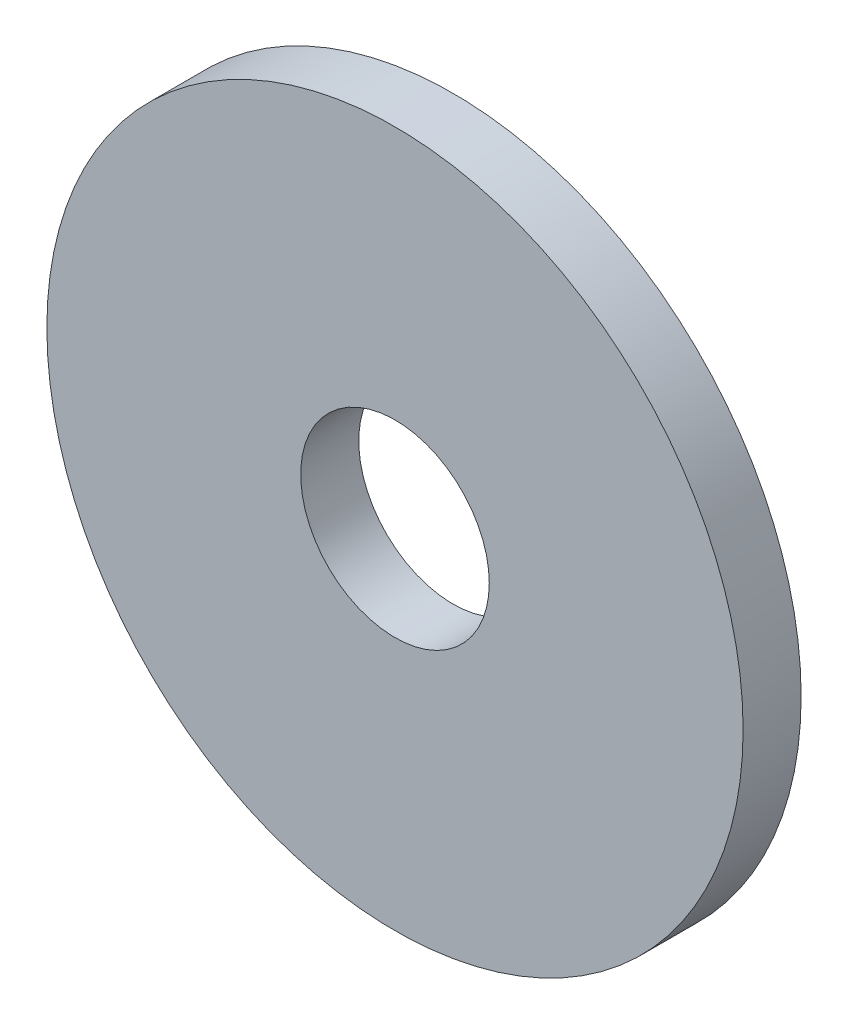
ISO-10303-21;
HEADER;
FILE_DESCRIPTION(('STEP AP214'),'2;1');
FILE_NAME('part.step','',(''),(''),'','','');
FILE_SCHEMA(('AUTOMOTIVE_DESIGN { 1 0 10303 214 1 1 1 1 }'));
ENDSEC;
DATA;
#1=APPLICATION_CONTEXT('core data for automotive mechanical design processes');
#2=APPLICATION_PROTOCOL_DEFINITION('international standard','automotive_design',2000,#1);
#3=PRODUCT_CONTEXT('',#1,'mechanical');
#4=PRODUCT('Part','Part','',(#3));
#5=PRODUCT_RELATED_PRODUCT_CATEGORY('part','',(#4));
#6=PRODUCT_DEFINITION_FORMATION('','',#4);
#7=PRODUCT_DEFINITION_CONTEXT('part definition',#1,'design');
#8=PRODUCT_DEFINITION('design','',#6,#7);
#9=PRODUCT_DEFINITION_SHAPE('','',#8);
#10=(LENGTH_UNIT() NAMED_UNIT(*) SI_UNIT(.MILLI.,.METRE.));
#11=(NAMED_UNIT(*) PLANE_ANGLE_UNIT() SI_UNIT($,.RADIAN.));
#12=(NAMED_UNIT(*) SI_UNIT($,.STERADIAN.) SOLID_ANGLE_UNIT());
#13=UNCERTAINTY_MEASURE_WITH_UNIT(LENGTH_MEASURE(1.E-05),#10,'distance_accuracy_value','');
#14=(GEOMETRIC_REPRESENTATION_CONTEXT(3) GLOBAL_UNCERTAINTY_ASSIGNED_CONTEXT((#13)) GLOBAL_UNIT_ASSIGNED_CONTEXT((#10,
#11,#12)) REPRESENTATION_CONTEXT('',''));
#15=CARTESIAN_POINT('',(0.,0.,0.));
#16=DIRECTION('',(0.,0.,1.));
#17=DIRECTION('',(1.,0.,0.));
#18=AXIS2_PLACEMENT_3D('',#15,#16,#17);
#19=CARTESIAN_POINT('',(0.,0.,1.));
#20=DIRECTION('',(0.,0.,1.));
#21=DIRECTION('',(1.,0.,0.));
#22=AXIS2_PLACEMENT_3D('',#19,#20,#21);
#23=PLANE('',#22);
#24=CARTESIAN_POINT('',(0.,0.,1.));
#25=DIRECTION('',(0.,0.,1.));
#26=DIRECTION('',(1.,0.,0.));
#27=AXIS2_PLACEMENT_3D('',#24,#25,#26);
#28=CIRCLE('',#27,6.);
#29=CARTESIAN_POINT('',(6.,0.,1.));
#30=VERTEX_POINT('',#29);
#31=EDGE_CURVE('E10',#30,#30,#28,.T.);
#32=ORIENTED_EDGE('',*,*,#31,.T.);
#33=EDGE_LOOP('',(#32));
#34=FACE_BOUND('',#33,.T.);
#35=CARTESIAN_POINT('',(0.,0.,1.));
#36=DIRECTION('',(0.,0.,1.));
#37=DIRECTION('',(1.,0.,0.));
#38=AXIS2_PLACEMENT_3D('',#35,#36,#37);
#39=CIRCLE('',#38,1.625);
#40=CARTESIAN_POINT('',(1.625,0.,1.));
#41=VERTEX_POINT('',#40);
#42=EDGE_CURVE('E54',#41,#41,#39,.T.);
#43=ORIENTED_EDGE('',*,*,#42,.F.);
#44=EDGE_LOOP('',(#43));
#45=FACE_BOUND('',#44,.T.);
#46=ADVANCED_FACE('F41',(#34,#45),#23,.T.);
#47=CARTESIAN_POINT('',(0.,0.,0.));
#48=DIRECTION('',(0.,0.,1.));
#49=DIRECTION('',(1.,0.,0.));
#50=AXIS2_PLACEMENT_3D('',#47,#48,#49);
#51=PLANE('',#50);
#52=CARTESIAN_POINT('',(0.,0.,0.));
#53=DIRECTION('',(0.,0.,1.));
#54=DIRECTION('',(1.,0.,0.));
#55=AXIS2_PLACEMENT_3D('',#52,#53,#54);
#56=CIRCLE('',#55,6.);
#57=CARTESIAN_POINT('',(6.,0.,0.));
#58=VERTEX_POINT('',#57);
#59=EDGE_CURVE('E45',#58,#58,#56,.T.);
#60=ORIENTED_EDGE('',*,*,#59,.F.);
#61=EDGE_LOOP('',(#60));
#62=FACE_BOUND('',#61,.T.);
#63=CARTESIAN_POINT('',(0.,0.,0.));
#64=DIRECTION('',(0.,0.,1.));
#65=DIRECTION('',(1.,0.,0.));
#66=AXIS2_PLACEMENT_3D('',#63,#64,#65);
#67=CIRCLE('',#66,1.625);
#68=CARTESIAN_POINT('',(1.625,0.,0.));
#69=VERTEX_POINT('',#68);
#70=EDGE_CURVE('E56',#69,#69,#67,.T.);
#71=ORIENTED_EDGE('',*,*,#70,.T.);
#72=EDGE_LOOP('',(#71));
#73=FACE_BOUND('',#72,.T.);
#74=ADVANCED_FACE('F68',(#62,#73),#51,.F.);
#75=CARTESIAN_POINT('',(0.,0.,1.));
#76=DIRECTION('',(0.,0.,-1.));
#77=DIRECTION('',(-1.,0.,0.));
#78=AXIS2_PLACEMENT_3D('',#75,#76,#77);
#79=CYLINDRICAL_SURFACE('',#78,6.);
#80=ORIENTED_EDGE('',*,*,#31,.F.);
#81=EDGE_LOOP('',(#80));
#82=FACE_BOUND('',#81,.T.);
#83=ORIENTED_EDGE('',*,*,#59,.T.);
#84=EDGE_LOOP('',(#83));
#85=FACE_BOUND('',#84,.T.);
#86=ADVANCED_FACE('F43',(#82,#85),#79,.T.);
#87=CARTESIAN_POINT('',(0.,0.,1.));
#88=DIRECTION('',(0.,0.,-1.));
#89=DIRECTION('',(-1.,0.,0.));
#90=AXIS2_PLACEMENT_3D('',#87,#88,#89);
#91=CYLINDRICAL_SURFACE('',#90,1.625);
#92=ORIENTED_EDGE('',*,*,#42,.T.);
#93=EDGE_LOOP('',(#92));
#94=FACE_BOUND('',#93,.T.);
#95=ORIENTED_EDGE('',*,*,#70,.F.);
#96=EDGE_LOOP('',(#95));
#97=FACE_BOUND('',#96,.T.);
#98=ADVANCED_FACE('F64',(#94,#97),#91,.F.);
#99=CLOSED_SHELL('',(#46,#74,#86,#98));
#100=MANIFOLD_SOLID_BREP('B2',#99);
#101=ADVANCED_BREP_SHAPE_REPRESENTATION('',(#18,#100),#14);
#102=SHAPE_DEFINITION_REPRESENTATION(#9,#101);
ENDSEC;
END-ISO-10303-21;
